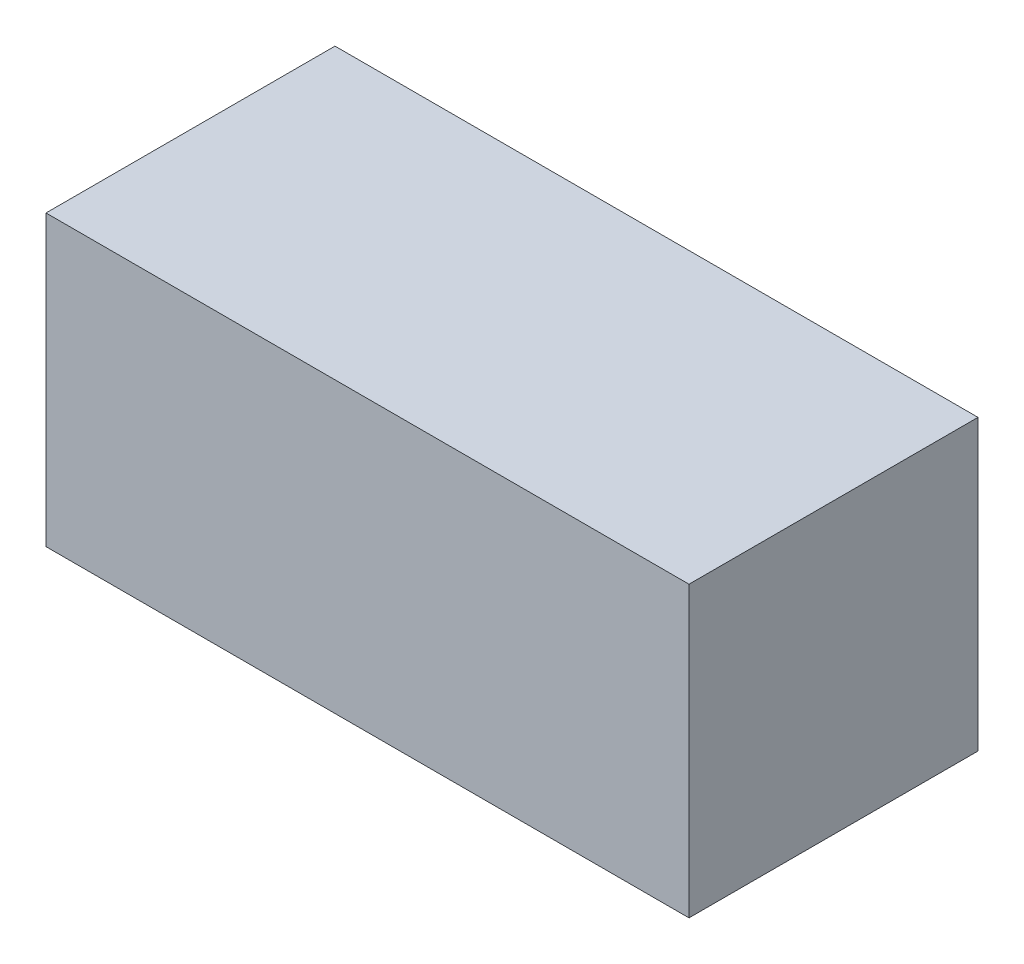
ISO-10303-21;
HEADER;
FILE_DESCRIPTION(('STEP AP214'),'2;1');
FILE_NAME('part.step','',(''),(''),'','','');
FILE_SCHEMA(('AUTOMOTIVE_DESIGN { 1 0 10303 214 1 1 1 1 }'));
ENDSEC;
DATA;
#1=APPLICATION_CONTEXT('core data for automotive mechanical design processes');
#2=APPLICATION_PROTOCOL_DEFINITION('international standard','automotive_design',2000,#1);
#3=PRODUCT_CONTEXT('',#1,'mechanical');
#4=PRODUCT('Part','Part','',(#3));
#5=PRODUCT_RELATED_PRODUCT_CATEGORY('part','',(#4));
#6=PRODUCT_DEFINITION_FORMATION('','',#4);
#7=PRODUCT_DEFINITION_CONTEXT('part definition',#1,'design');
#8=PRODUCT_DEFINITION('design','',#6,#7);
#9=PRODUCT_DEFINITION_SHAPE('','',#8);
#10=(LENGTH_UNIT() NAMED_UNIT(*) SI_UNIT(.MILLI.,.METRE.));
#11=(NAMED_UNIT(*) PLANE_ANGLE_UNIT() SI_UNIT($,.RADIAN.));
#12=(NAMED_UNIT(*) SI_UNIT($,.STERADIAN.) SOLID_ANGLE_UNIT());
#13=UNCERTAINTY_MEASURE_WITH_UNIT(LENGTH_MEASURE(1.E-05),#10,'distance_accuracy_value','');
#14=(GEOMETRIC_REPRESENTATION_CONTEXT(3) GLOBAL_UNCERTAINTY_ASSIGNED_CONTEXT((#13)) GLOBAL_UNIT_ASSIGNED_CONTEXT((#10,
#11,#12)) REPRESENTATION_CONTEXT('',''));
#15=CARTESIAN_POINT('',(0.,0.,0.));
#16=DIRECTION('',(0.,0.,1.));
#17=DIRECTION('',(1.,0.,0.));
#18=AXIS2_PLACEMENT_3D('',#15,#16,#17);
#19=CARTESIAN_POINT('',(1.125,-0.5,1.));
#20=DIRECTION('',(0.,1.,0.));
#21=DIRECTION('',(0.,0.,1.));
#22=AXIS2_PLACEMENT_3D('',#19,#20,#21);
#23=PLANE('',#22);
#24=DIRECTION('',(1.,0.,0.));
#25=VECTOR('',#24,1.);
#26=CARTESIAN_POINT('',(1.125,-0.5,0.));
#27=LINE('',#26,#25);
#28=CARTESIAN_POINT('',(-1.1,-0.5,0.));
#29=VERTEX_POINT('',#28);
#30=CARTESIAN_POINT('',(1.125,-0.5,0.));
#31=VERTEX_POINT('',#30);
#32=EDGE_CURVE('E97',#29,#31,#27,.T.);
#33=ORIENTED_EDGE('',*,*,#32,.T.);
#34=DIRECTION('',(0.,0.,-1.));
#35=VECTOR('',#34,1.);
#36=CARTESIAN_POINT('',(1.125,-0.5,1.));
#37=LINE('',#36,#35);
#38=CARTESIAN_POINT('',(1.125,-0.5,1.));
#39=VERTEX_POINT('',#38);
#40=EDGE_CURVE('E11',#39,#31,#37,.T.);
#41=ORIENTED_EDGE('',*,*,#40,.F.);
#42=DIRECTION('',(1.,0.,0.));
#43=VECTOR('',#42,1.);
#44=CARTESIAN_POINT('',(1.125,-0.5,1.));
#45=LINE('',#44,#43);
#46=CARTESIAN_POINT('',(-1.1,-0.5,1.));
#47=VERTEX_POINT('',#46);
#48=EDGE_CURVE('E85',#47,#39,#45,.T.);
#49=ORIENTED_EDGE('',*,*,#48,.F.);
#50=DIRECTION('',(0.,0.,-1.));
#51=VECTOR('',#50,1.);
#52=CARTESIAN_POINT('',(-1.1,-0.5,1.));
#53=LINE('',#52,#51);
#54=EDGE_CURVE('E93',#47,#29,#53,.T.);
#55=ORIENTED_EDGE('',*,*,#54,.T.);
#56=EDGE_LOOP('',(#33,#41,#49,#55));
#57=FACE_BOUND('',#56,.T.);
#58=ADVANCED_FACE('F34',(#57),#23,.F.);
#59=CARTESIAN_POINT('',(1.125,0.5,1.));
#60=DIRECTION('',(-1.,0.,0.));
#61=DIRECTION('',(0.,0.,1.));
#62=AXIS2_PLACEMENT_3D('',#59,#60,#61);
#63=PLANE('',#62);
#64=DIRECTION('',(0.,1.,0.));
#65=VECTOR('',#64,1.);
#66=CARTESIAN_POINT('',(1.125,0.5,0.));
#67=LINE('',#66,#65);
#68=CARTESIAN_POINT('',(1.125,0.5,0.));
#69=VERTEX_POINT('',#68);
#70=EDGE_CURVE('E89',#31,#69,#67,.T.);
#71=ORIENTED_EDGE('',*,*,#70,.T.);
#72=DIRECTION('',(0.,0.,-1.));
#73=VECTOR('',#72,1.);
#74=CARTESIAN_POINT('',(1.125,0.5,1.));
#75=LINE('',#74,#73);
#76=CARTESIAN_POINT('',(1.125,0.5,1.));
#77=VERTEX_POINT('',#76);
#78=EDGE_CURVE('E42',#77,#69,#75,.T.);
#79=ORIENTED_EDGE('',*,*,#78,.F.);
#80=DIRECTION('',(0.,1.,0.));
#81=VECTOR('',#80,1.);
#82=CARTESIAN_POINT('',(1.125,0.5,1.));
#83=LINE('',#82,#81);
#84=EDGE_CURVE('E80',#39,#77,#83,.T.);
#85=ORIENTED_EDGE('',*,*,#84,.F.);
#86=ORIENTED_EDGE('',*,*,#40,.T.);
#87=EDGE_LOOP('',(#71,#79,#85,#86));
#88=FACE_BOUND('',#87,.T.);
#89=ADVANCED_FACE('F88',(#88),#63,.F.);
#90=CARTESIAN_POINT('',(-1.1,0.5,1.));
#91=DIRECTION('',(0.,-1.,0.));
#92=DIRECTION('',(0.,0.,-1.));
#93=AXIS2_PLACEMENT_3D('',#90,#91,#92);
#94=PLANE('',#93);
#95=DIRECTION('',(-1.,0.,0.));
#96=VECTOR('',#95,1.);
#97=CARTESIAN_POINT('',(-1.1,0.5,0.));
#98=LINE('',#97,#96);
#99=CARTESIAN_POINT('',(-1.1,0.5,0.));
#100=VERTEX_POINT('',#99);
#101=EDGE_CURVE('E67',#69,#100,#98,.T.);
#102=ORIENTED_EDGE('',*,*,#101,.T.);
#103=DIRECTION('',(0.,0.,-1.));
#104=VECTOR('',#103,1.);
#105=CARTESIAN_POINT('',(-1.1,0.5,1.));
#106=LINE('',#105,#104);
#107=CARTESIAN_POINT('',(-1.1,0.5,1.));
#108=VERTEX_POINT('',#107);
#109=EDGE_CURVE('E90',#108,#100,#106,.T.);
#110=ORIENTED_EDGE('',*,*,#109,.F.);
#111=DIRECTION('',(-1.,0.,0.));
#112=VECTOR('',#111,1.);
#113=CARTESIAN_POINT('',(-1.1,0.5,1.));
#114=LINE('',#113,#112);
#115=EDGE_CURVE('E83',#77,#108,#114,.T.);
#116=ORIENTED_EDGE('',*,*,#115,.F.);
#117=ORIENTED_EDGE('',*,*,#78,.T.);
#118=EDGE_LOOP('',(#102,#110,#116,#117));
#119=FACE_BOUND('',#118,.T.);
#120=ADVANCED_FACE('F91',(#119),#94,.F.);
#121=CARTESIAN_POINT('',(-1.1,-0.5,1.));
#122=DIRECTION('',(1.,0.,0.));
#123=DIRECTION('',(0.,0.,-1.));
#124=AXIS2_PLACEMENT_3D('',#121,#122,#123);
#125=PLANE('',#124);
#126=DIRECTION('',(0.,-1.,0.));
#127=VECTOR('',#126,1.);
#128=CARTESIAN_POINT('',(-1.1,-0.5,0.));
#129=LINE('',#128,#127);
#130=EDGE_CURVE('E73',#100,#29,#129,.T.);
#131=ORIENTED_EDGE('',*,*,#130,.T.);
#132=ORIENTED_EDGE('',*,*,#54,.F.);
#133=DIRECTION('',(0.,-1.,0.));
#134=VECTOR('',#133,1.);
#135=CARTESIAN_POINT('',(-1.1,-0.5,1.));
#136=LINE('',#135,#134);
#137=EDGE_CURVE('E50',#108,#47,#136,.T.);
#138=ORIENTED_EDGE('',*,*,#137,.F.);
#139=ORIENTED_EDGE('',*,*,#109,.T.);
#140=EDGE_LOOP('',(#131,#132,#138,#139));
#141=FACE_BOUND('',#140,.T.);
#142=ADVANCED_FACE('F104',(#141),#125,.F.);
#143=CARTESIAN_POINT('',(0.,0.,1.));
#144=DIRECTION('',(0.,0.,-1.));
#145=DIRECTION('',(-1.,0.,0.));
#146=AXIS2_PLACEMENT_3D('',#143,#144,#145);
#147=PLANE('',#146);
#148=ORIENTED_EDGE('',*,*,#48,.T.);
#149=ORIENTED_EDGE('',*,*,#84,.T.);
#150=ORIENTED_EDGE('',*,*,#115,.T.);
#151=ORIENTED_EDGE('',*,*,#137,.T.);
#152=EDGE_LOOP('',(#148,#149,#150,#151));
#153=FACE_BOUND('',#152,.T.);
#154=ADVANCED_FACE('F81',(#153),#147,.F.);
#155=CARTESIAN_POINT('',(0.,0.,0.));
#156=DIRECTION('',(0.,0.,-1.));
#157=DIRECTION('',(-1.,0.,0.));
#158=AXIS2_PLACEMENT_3D('',#155,#156,#157);
#159=PLANE('',#158);
#160=ORIENTED_EDGE('',*,*,#32,.F.);
#161=ORIENTED_EDGE('',*,*,#130,.F.);
#162=ORIENTED_EDGE('',*,*,#101,.F.);
#163=ORIENTED_EDGE('',*,*,#70,.F.);
#164=EDGE_LOOP('',(#160,#161,#162,#163));
#165=FACE_BOUND('',#164,.T.);
#166=ADVANCED_FACE('F107',(#165),#159,.T.);
#167=CLOSED_SHELL('',(#58,#89,#120,#142,#154,#166));
#168=MANIFOLD_SOLID_BREP('B2',#167);
#169=ADVANCED_BREP_SHAPE_REPRESENTATION('',(#18,#168),#14);
#170=SHAPE_DEFINITION_REPRESENTATION(#9,#169);
ENDSEC;
END-ISO-10303-21;
